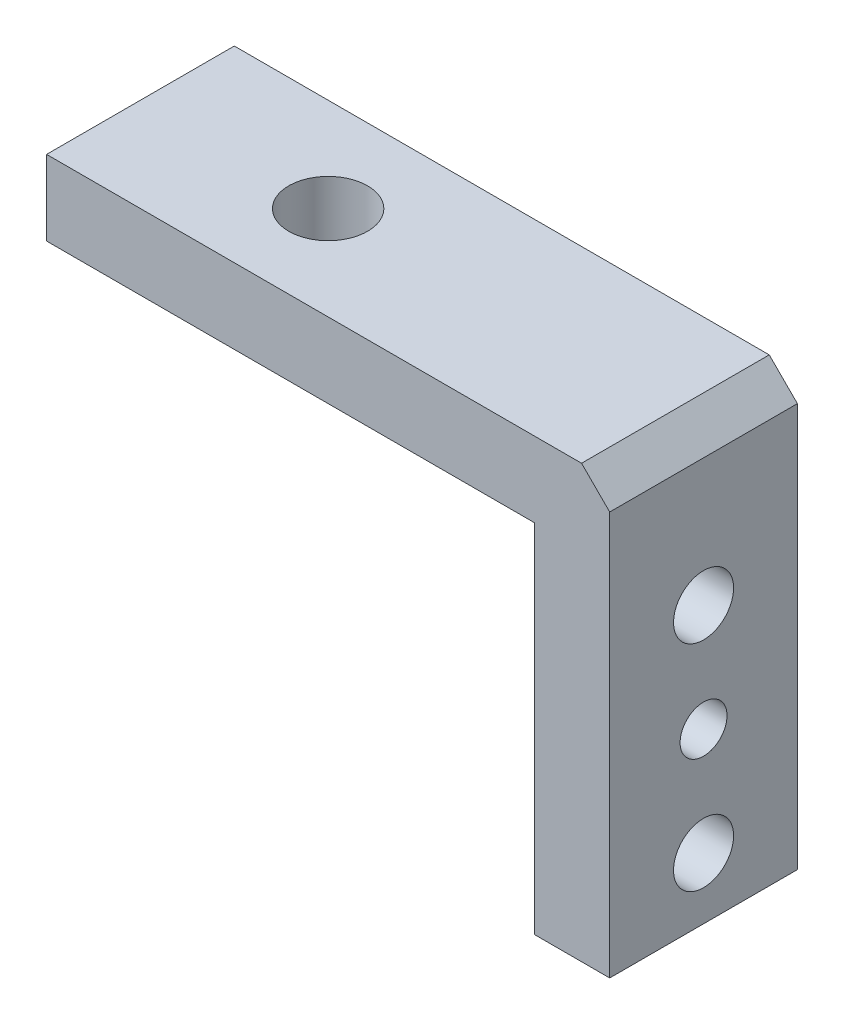
ISO-10303-21;
HEADER;
FILE_DESCRIPTION(('STEP AP214'),'2;1');
FILE_NAME('part.step','',(''),(''),'','','');
FILE_SCHEMA(('AUTOMOTIVE_DESIGN { 1 0 10303 214 1 1 1 1 }'));
ENDSEC;
DATA;
#1=APPLICATION_CONTEXT('core data for automotive mechanical design processes');
#2=APPLICATION_PROTOCOL_DEFINITION('international standard','automotive_design',2000,#1);
#3=PRODUCT_CONTEXT('',#1,'mechanical');
#4=PRODUCT('Part','Part','',(#3));
#5=PRODUCT_RELATED_PRODUCT_CATEGORY('part','',(#4));
#6=PRODUCT_DEFINITION_FORMATION('','',#4);
#7=PRODUCT_DEFINITION_CONTEXT('part definition',#1,'design');
#8=PRODUCT_DEFINITION('design','',#6,#7);
#9=PRODUCT_DEFINITION_SHAPE('','',#8);
#10=(LENGTH_UNIT() NAMED_UNIT(*) SI_UNIT(.MILLI.,.METRE.));
#11=(NAMED_UNIT(*) PLANE_ANGLE_UNIT() SI_UNIT($,.RADIAN.));
#12=(NAMED_UNIT(*) SI_UNIT($,.STERADIAN.) SOLID_ANGLE_UNIT());
#13=UNCERTAINTY_MEASURE_WITH_UNIT(LENGTH_MEASURE(1.E-05),#10,'distance_accuracy_value','');
#14=(GEOMETRIC_REPRESENTATION_CONTEXT(3) GLOBAL_UNCERTAINTY_ASSIGNED_CONTEXT((#13)) GLOBAL_UNIT_ASSIGNED_CONTEXT((#10,
#11,#12)) REPRESENTATION_CONTEXT('',''));
#15=CARTESIAN_POINT('',(0.,0.,0.));
#16=DIRECTION('',(0.,0.,1.));
#17=DIRECTION('',(1.,0.,0.));
#18=AXIS2_PLACEMENT_3D('',#15,#16,#17);
#19=CARTESIAN_POINT('',(-15.,-11.5,5.));
#20=DIRECTION('',(1.,0.,0.));
#21=DIRECTION('',(0.,0.,-1.));
#22=AXIS2_PLACEMENT_3D('',#19,#20,#21);
#23=PLANE('',#22);
#24=DIRECTION('',(0.,-1.,0.));
#25=VECTOR('',#24,1.);
#26=CARTESIAN_POINT('',(-15.,-11.5,-5.));
#27=LINE('',#26,#25);
#28=CARTESIAN_POINT('',(-15.,11.5,-5.));
#29=VERTEX_POINT('',#28);
#30=CARTESIAN_POINT('',(-15.,7.5,-5.));
#31=VERTEX_POINT('',#30);
#32=EDGE_CURVE('E117',#29,#31,#27,.T.);
#33=ORIENTED_EDGE('',*,*,#32,.T.);
#34=DIRECTION('',(0.,0.,1.));
#35=VECTOR('',#34,1.);
#36=CARTESIAN_POINT('',(-15.,7.5,-5.));
#37=LINE('',#36,#35);
#38=CARTESIAN_POINT('',(-15.,7.5,5.));
#39=VERTEX_POINT('',#38);
#40=EDGE_CURVE('E122',#31,#39,#37,.T.);
#41=ORIENTED_EDGE('',*,*,#40,.T.);
#42=DIRECTION('',(0.,-1.,0.));
#43=VECTOR('',#42,1.);
#44=CARTESIAN_POINT('',(-15.,-11.5,5.));
#45=LINE('',#44,#43);
#46=CARTESIAN_POINT('',(-15.,11.5,5.));
#47=VERTEX_POINT('',#46);
#48=EDGE_CURVE('E127',#47,#39,#45,.T.);
#49=ORIENTED_EDGE('',*,*,#48,.F.);
#50=DIRECTION('',(0.,0.,-1.));
#51=VECTOR('',#50,1.);
#52=CARTESIAN_POINT('',(-15.,11.5,5.));
#53=LINE('',#52,#51);
#54=EDGE_CURVE('E128',#47,#29,#53,.T.);
#55=ORIENTED_EDGE('',*,*,#54,.T.);
#56=EDGE_LOOP('',(#33,#41,#49,#55));
#57=FACE_BOUND('',#56,.T.);
#58=ADVANCED_FACE('F35',(#57),#23,.F.);
#59=CARTESIAN_POINT('',(15.,-11.5,5.));
#60=DIRECTION('',(0.,1.,0.));
#61=DIRECTION('',(-1.,0.,0.));
#62=AXIS2_PLACEMENT_3D('',#59,#60,#61);
#63=PLANE('',#62);
#64=DIRECTION('',(1.,0.,0.));
#65=VECTOR('',#64,1.);
#66=CARTESIAN_POINT('',(15.,-11.5,5.));
#67=LINE('',#66,#65);
#68=CARTESIAN_POINT('',(11.,-11.5,5.));
#69=VERTEX_POINT('',#68);
#70=CARTESIAN_POINT('',(15.,-11.5,5.));
#71=VERTEX_POINT('',#70);
#72=EDGE_CURVE('E113',#69,#71,#67,.T.);
#73=ORIENTED_EDGE('',*,*,#72,.F.);
#74=DIRECTION('',(0.,0.,1.));
#75=VECTOR('',#74,1.);
#76=CARTESIAN_POINT('',(11.,-11.5,-5.));
#77=LINE('',#76,#75);
#78=CARTESIAN_POINT('',(11.,-11.5,-5.));
#79=VERTEX_POINT('',#78);
#80=EDGE_CURVE('E99',#79,#69,#77,.T.);
#81=ORIENTED_EDGE('',*,*,#80,.F.);
#82=DIRECTION('',(1.,0.,0.));
#83=VECTOR('',#82,1.);
#84=CARTESIAN_POINT('',(15.,-11.5,-5.));
#85=LINE('',#84,#83);
#86=CARTESIAN_POINT('',(15.,-11.5,-5.));
#87=VERTEX_POINT('',#86);
#88=EDGE_CURVE('E111',#79,#87,#85,.T.);
#89=ORIENTED_EDGE('',*,*,#88,.T.);
#90=DIRECTION('',(0.,0.,-1.));
#91=VECTOR('',#90,1.);
#92=CARTESIAN_POINT('',(15.,-11.5,5.));
#93=LINE('',#92,#91);
#94=EDGE_CURVE('E131',#71,#87,#93,.T.);
#95=ORIENTED_EDGE('',*,*,#94,.F.);
#96=EDGE_LOOP('',(#73,#81,#89,#95));
#97=FACE_BOUND('',#96,.T.);
#98=ADVANCED_FACE('F109',(#97),#63,.F.);
#99=CARTESIAN_POINT('',(15.,-11.5,5.));
#100=DIRECTION('',(-1.,0.,0.));
#101=DIRECTION('',(0.,0.,1.));
#102=AXIS2_PLACEMENT_3D('',#99,#100,#101);
#103=PLANE('',#102);
#104=CARTESIAN_POINT('',(15.,-2.517,0.));
#105=DIRECTION('',(1.,0.,0.));
#106=DIRECTION('',(0.,0.,-1.));
#107=AXIS2_PLACEMENT_3D('',#104,#105,#106);
#108=CIRCLE('',#107,1.24999999999999);
#109=CARTESIAN_POINT('',(15.,-2.517,-1.24999999999999));
#110=VERTEX_POINT('',#109);
#111=EDGE_CURVE('E205',#110,#110,#108,.T.);
#112=ORIENTED_EDGE('',*,*,#111,.F.);
#113=EDGE_LOOP('',(#112));
#114=FACE_BOUND('',#113,.T.);
#115=CARTESIAN_POINT('',(15.,-8.232,0.));
#116=DIRECTION('',(1.,0.,0.));
#117=DIRECTION('',(0.,0.,-1.));
#118=AXIS2_PLACEMENT_3D('',#115,#116,#117);
#119=CIRCLE('',#118,1.6);
#120=CARTESIAN_POINT('',(15.,-8.232,-1.6));
#121=VERTEX_POINT('',#120);
#122=EDGE_CURVE('E209',#121,#121,#119,.T.);
#123=ORIENTED_EDGE('',*,*,#122,.F.);
#124=EDGE_LOOP('',(#123));
#125=FACE_BOUND('',#124,.T.);
#126=CARTESIAN_POINT('',(15.,3.198,0.));
#127=DIRECTION('',(1.,0.,0.));
#128=DIRECTION('',(0.,0.,-1.));
#129=AXIS2_PLACEMENT_3D('',#126,#127,#128);
#130=CIRCLE('',#129,1.6);
#131=CARTESIAN_POINT('',(15.,3.198,-1.6));
#132=VERTEX_POINT('',#131);
#133=EDGE_CURVE('E215',#132,#132,#130,.T.);
#134=ORIENTED_EDGE('',*,*,#133,.F.);
#135=EDGE_LOOP('',(#134));
#136=FACE_BOUND('',#135,.T.);
#137=DIRECTION('',(0.,1.,0.));
#138=VECTOR('',#137,1.);
#139=CARTESIAN_POINT('',(15.,-11.5,-5.));
#140=LINE('',#139,#138);
#141=CARTESIAN_POINT('',(15.,9.99999999999999,-5.));
#142=VERTEX_POINT('',#141);
#143=EDGE_CURVE('E116',#87,#142,#140,.T.);
#144=ORIENTED_EDGE('',*,*,#143,.T.);
#145=DIRECTION('',(0.,0.,1.));
#146=VECTOR('',#145,1.);
#147=CARTESIAN_POINT('',(15.,9.99999999999999,5.));
#148=LINE('',#147,#146);
#149=CARTESIAN_POINT('',(15.,9.99999999999999,5.));
#150=VERTEX_POINT('',#149);
#151=EDGE_CURVE('E44',#142,#150,#148,.T.);
#152=ORIENTED_EDGE('',*,*,#151,.T.);
#153=DIRECTION('',(0.,1.,0.));
#154=VECTOR('',#153,1.);
#155=CARTESIAN_POINT('',(15.,-11.5,5.));
#156=LINE('',#155,#154);
#157=EDGE_CURVE('E153',#71,#150,#156,.T.);
#158=ORIENTED_EDGE('',*,*,#157,.F.);
#159=ORIENTED_EDGE('',*,*,#94,.T.);
#160=EDGE_LOOP('',(#144,#152,#158,#159));
#161=FACE_BOUND('',#160,.T.);
#162=ADVANCED_FACE('F174',(#114,#125,#136,#161),#103,.F.);
#163=CARTESIAN_POINT('',(15.,11.5,5.));
#164=DIRECTION('',(0.,-1.,0.));
#165=DIRECTION('',(1.,0.,0.));
#166=AXIS2_PLACEMENT_3D('',#163,#164,#165);
#167=PLANE('',#166);
#168=CARTESIAN_POINT('',(-5.,11.5,0.));
#169=DIRECTION('',(0.,1.,0.));
#170=DIRECTION('',(0.,0.,1.));
#171=AXIS2_PLACEMENT_3D('',#168,#169,#170);
#172=CIRCLE('',#171,2.1);
#173=CARTESIAN_POINT('',(-5.,11.5,2.1));
#174=VERTEX_POINT('',#173);
#175=EDGE_CURVE('E221',#174,#174,#172,.T.);
#176=ORIENTED_EDGE('',*,*,#175,.F.);
#177=EDGE_LOOP('',(#176));
#178=FACE_BOUND('',#177,.T.);
#179=DIRECTION('',(-1.,0.,0.));
#180=VECTOR('',#179,1.);
#181=CARTESIAN_POINT('',(15.,11.5,5.));
#182=LINE('',#181,#180);
#183=CARTESIAN_POINT('',(13.5,11.5,5.));
#184=VERTEX_POINT('',#183);
#185=EDGE_CURVE('E132',#184,#47,#182,.T.);
#186=ORIENTED_EDGE('',*,*,#185,.F.);
#187=DIRECTION('',(0.,0.,-1.));
#188=VECTOR('',#187,1.);
#189=CARTESIAN_POINT('',(13.5,11.5,5.));
#190=LINE('',#189,#188);
#191=CARTESIAN_POINT('',(13.5,11.5,-5.));
#192=VERTEX_POINT('',#191);
#193=EDGE_CURVE('E134',#184,#192,#190,.T.);
#194=ORIENTED_EDGE('',*,*,#193,.T.);
#195=DIRECTION('',(-1.,0.,0.));
#196=VECTOR('',#195,1.);
#197=CARTESIAN_POINT('',(15.,11.5,-5.));
#198=LINE('',#197,#196);
#199=EDGE_CURVE('E119',#192,#29,#198,.T.);
#200=ORIENTED_EDGE('',*,*,#199,.T.);
#201=ORIENTED_EDGE('',*,*,#54,.F.);
#202=EDGE_LOOP('',(#186,#194,#200,#201));
#203=FACE_BOUND('',#202,.T.);
#204=ADVANCED_FACE('F141',(#178,#203),#167,.F.);
#205=CARTESIAN_POINT('',(0.,0.,5.));
#206=DIRECTION('',(0.,0.,1.));
#207=DIRECTION('',(1.,0.,0.));
#208=AXIS2_PLACEMENT_3D('',#205,#206,#207);
#209=PLANE('',#208);
#210=ORIENTED_EDGE('',*,*,#157,.T.);
#211=DIRECTION('',(0.707106781186546,-0.707106781186549,0.));
#212=VECTOR('',#211,1.);
#213=CARTESIAN_POINT('',(12.5,12.5,5.));
#214=LINE('',#213,#212);
#215=EDGE_CURVE('E11',#150,#184,#214,.F.);
#216=ORIENTED_EDGE('',*,*,#215,.T.);
#217=ORIENTED_EDGE('',*,*,#185,.T.);
#218=ORIENTED_EDGE('',*,*,#48,.T.);
#219=DIRECTION('',(-1.,0.,0.));
#220=VECTOR('',#219,1.);
#221=CARTESIAN_POINT('',(-15.,7.5,5.));
#222=LINE('',#221,#220);
#223=CARTESIAN_POINT('',(11.,7.5,5.));
#224=VERTEX_POINT('',#223);
#225=EDGE_CURVE('E105',#224,#39,#222,.T.);
#226=ORIENTED_EDGE('',*,*,#225,.F.);
#227=DIRECTION('',(0.,1.,0.));
#228=VECTOR('',#227,1.);
#229=CARTESIAN_POINT('',(11.,-11.5,5.));
#230=LINE('',#229,#228);
#231=EDGE_CURVE('E226',#69,#224,#230,.T.);
#232=ORIENTED_EDGE('',*,*,#231,.F.);
#233=ORIENTED_EDGE('',*,*,#72,.T.);
#234=EDGE_LOOP('',(#210,#216,#217,#218,#226,#232,#233));
#235=FACE_BOUND('',#234,.T.);
#236=ADVANCED_FACE('F157',(#235),#209,.T.);
#237=CARTESIAN_POINT('',(0.,0.,-5.));
#238=DIRECTION('',(0.,0.,1.));
#239=DIRECTION('',(1.,0.,0.));
#240=AXIS2_PLACEMENT_3D('',#237,#238,#239);
#241=PLANE('',#240);
#242=ORIENTED_EDGE('',*,*,#199,.F.);
#243=DIRECTION('',(-0.707106781186546,0.707106781186549,0.));
#244=VECTOR('',#243,1.);
#245=CARTESIAN_POINT('',(13.5,11.5,-5.));
#246=LINE('',#245,#244);
#247=EDGE_CURVE('E58',#192,#142,#246,.F.);
#248=ORIENTED_EDGE('',*,*,#247,.T.);
#249=ORIENTED_EDGE('',*,*,#143,.F.);
#250=ORIENTED_EDGE('',*,*,#88,.F.);
#251=DIRECTION('',(0.,1.,0.));
#252=VECTOR('',#251,1.);
#253=CARTESIAN_POINT('',(11.,-11.5,-5.));
#254=LINE('',#253,#252);
#255=CARTESIAN_POINT('',(11.,7.5,-5.));
#256=VERTEX_POINT('',#255);
#257=EDGE_CURVE('E95',#79,#256,#254,.T.);
#258=ORIENTED_EDGE('',*,*,#257,.T.);
#259=DIRECTION('',(-1.,0.,0.));
#260=VECTOR('',#259,1.);
#261=CARTESIAN_POINT('',(-15.,7.5,-5.));
#262=LINE('',#261,#260);
#263=EDGE_CURVE('E104',#256,#31,#262,.T.);
#264=ORIENTED_EDGE('',*,*,#263,.T.);
#265=ORIENTED_EDGE('',*,*,#32,.F.);
#266=EDGE_LOOP('',(#242,#248,#249,#250,#258,#264,#265));
#267=FACE_BOUND('',#266,.T.);
#268=ADVANCED_FACE('F115',(#267),#241,.F.);
#269=CARTESIAN_POINT('',(-15.,7.5,-5.));
#270=DIRECTION('',(0.,1.,0.));
#271=DIRECTION('',(0.,0.,1.));
#272=AXIS2_PLACEMENT_3D('',#269,#270,#271);
#273=PLANE('',#272);
#274=CARTESIAN_POINT('',(-5.,7.5,0.));
#275=DIRECTION('',(0.,1.,0.));
#276=DIRECTION('',(0.,0.,1.));
#277=AXIS2_PLACEMENT_3D('',#274,#275,#276);
#278=CIRCLE('',#277,2.1);
#279=CARTESIAN_POINT('',(-5.,7.5,2.1));
#280=VERTEX_POINT('',#279);
#281=EDGE_CURVE('E224',#280,#280,#278,.T.);
#282=ORIENTED_EDGE('',*,*,#281,.T.);
#283=EDGE_LOOP('',(#282));
#284=FACE_BOUND('',#283,.T.);
#285=ORIENTED_EDGE('',*,*,#225,.T.);
#286=ORIENTED_EDGE('',*,*,#40,.F.);
#287=ORIENTED_EDGE('',*,*,#263,.F.);
#288=DIRECTION('',(0.,0.,1.));
#289=VECTOR('',#288,1.);
#290=CARTESIAN_POINT('',(11.,7.5,-5.));
#291=LINE('',#290,#289);
#292=EDGE_CURVE('E101',#256,#224,#291,.T.);
#293=ORIENTED_EDGE('',*,*,#292,.T.);
#294=EDGE_LOOP('',(#285,#286,#287,#293));
#295=FACE_BOUND('',#294,.T.);
#296=ADVANCED_FACE('F167',(#284,#295),#273,.F.);
#297=CARTESIAN_POINT('',(11.,-11.5,-5.));
#298=DIRECTION('',(1.,0.,0.));
#299=DIRECTION('',(0.,0.,-1.));
#300=AXIS2_PLACEMENT_3D('',#297,#298,#299);
#301=PLANE('',#300);
#302=CARTESIAN_POINT('',(11.,-2.517,0.));
#303=DIRECTION('',(1.,0.,0.));
#304=DIRECTION('',(0.,0.,-1.));
#305=AXIS2_PLACEMENT_3D('',#302,#303,#304);
#306=CIRCLE('',#305,1.24999999999999);
#307=CARTESIAN_POINT('',(11.,-2.517,-1.24999999999999));
#308=VERTEX_POINT('',#307);
#309=EDGE_CURVE('E208',#308,#308,#306,.T.);
#310=ORIENTED_EDGE('',*,*,#309,.T.);
#311=EDGE_LOOP('',(#310));
#312=FACE_BOUND('',#311,.T.);
#313=CARTESIAN_POINT('',(11.,-8.232,0.));
#314=DIRECTION('',(1.,0.,0.));
#315=DIRECTION('',(0.,0.,-1.));
#316=AXIS2_PLACEMENT_3D('',#313,#314,#315);
#317=CIRCLE('',#316,1.59999999999999);
#318=CARTESIAN_POINT('',(11.,-8.232,-1.59999999999999));
#319=VERTEX_POINT('',#318);
#320=EDGE_CURVE('E39',#319,#319,#317,.T.);
#321=ORIENTED_EDGE('',*,*,#320,.T.);
#322=EDGE_LOOP('',(#321));
#323=FACE_BOUND('',#322,.T.);
#324=CARTESIAN_POINT('',(11.,3.198,0.));
#325=DIRECTION('',(1.,0.,0.));
#326=DIRECTION('',(0.,0.,-1.));
#327=AXIS2_PLACEMENT_3D('',#324,#325,#326);
#328=CIRCLE('',#327,1.59999999999999);
#329=CARTESIAN_POINT('',(11.,3.198,-1.59999999999999));
#330=VERTEX_POINT('',#329);
#331=EDGE_CURVE('E218',#330,#330,#328,.T.);
#332=ORIENTED_EDGE('',*,*,#331,.T.);
#333=EDGE_LOOP('',(#332));
#334=FACE_BOUND('',#333,.T.);
#335=ORIENTED_EDGE('',*,*,#231,.T.);
#336=ORIENTED_EDGE('',*,*,#292,.F.);
#337=ORIENTED_EDGE('',*,*,#257,.F.);
#338=ORIENTED_EDGE('',*,*,#80,.T.);
#339=EDGE_LOOP('',(#335,#336,#337,#338));
#340=FACE_BOUND('',#339,.T.);
#341=ADVANCED_FACE('F98',(#312,#323,#334,#340),#301,.F.);
#342=CARTESIAN_POINT('',(13.5,11.5,5.));
#343=DIRECTION('',(-0.707106781186549,-0.707106781186546,0.));
#344=DIRECTION('',(0.,0.,-1.));
#345=AXIS2_PLACEMENT_3D('',#342,#343,#344);
#346=PLANE('',#345);
#347=ORIENTED_EDGE('',*,*,#215,.F.);
#348=ORIENTED_EDGE('',*,*,#151,.F.);
#349=ORIENTED_EDGE('',*,*,#247,.F.);
#350=ORIENTED_EDGE('',*,*,#193,.F.);
#351=EDGE_LOOP('',(#347,#348,#349,#350));
#352=FACE_BOUND('',#351,.T.);
#353=ADVANCED_FACE('F37',(#352),#346,.F.);
#354=CARTESIAN_POINT('',(-5.,11.5,0.));
#355=DIRECTION('',(0.,1.,0.));
#356=DIRECTION('',(0.,0.,1.));
#357=AXIS2_PLACEMENT_3D('',#354,#355,#356);
#358=CYLINDRICAL_SURFACE('',#357,2.1);
#359=ORIENTED_EDGE('',*,*,#175,.T.);
#360=EDGE_LOOP('',(#359));
#361=FACE_BOUND('',#360,.T.);
#362=ORIENTED_EDGE('',*,*,#281,.F.);
#363=EDGE_LOOP('',(#362));
#364=FACE_BOUND('',#363,.T.);
#365=ADVANCED_FACE('F159',(#361,#364),#358,.F.);
#366=CARTESIAN_POINT('',(15.,3.198,0.));
#367=DIRECTION('',(1.,0.,0.));
#368=DIRECTION('',(0.,0.,-1.));
#369=AXIS2_PLACEMENT_3D('',#366,#367,#368);
#370=CYLINDRICAL_SURFACE('',#369,1.59999999999999);
#371=ORIENTED_EDGE('',*,*,#133,.T.);
#372=EDGE_LOOP('',(#371));
#373=FACE_BOUND('',#372,.T.);
#374=ORIENTED_EDGE('',*,*,#331,.F.);
#375=EDGE_LOOP('',(#374));
#376=FACE_BOUND('',#375,.T.);
#377=ADVANCED_FACE('F164',(#373,#376),#370,.F.);
#378=CARTESIAN_POINT('',(15.,-8.232,0.));
#379=DIRECTION('',(1.,0.,0.));
#380=DIRECTION('',(0.,0.,-1.));
#381=AXIS2_PLACEMENT_3D('',#378,#379,#380);
#382=CYLINDRICAL_SURFACE('',#381,1.59999999999999);
#383=ORIENTED_EDGE('',*,*,#122,.T.);
#384=EDGE_LOOP('',(#383));
#385=FACE_BOUND('',#384,.T.);
#386=ORIENTED_EDGE('',*,*,#320,.F.);
#387=EDGE_LOOP('',(#386));
#388=FACE_BOUND('',#387,.T.);
#389=ADVANCED_FACE('F192',(#385,#388),#382,.F.);
#390=CARTESIAN_POINT('',(15.,-2.517,0.));
#391=DIRECTION('',(1.,0.,0.));
#392=DIRECTION('',(0.,0.,-1.));
#393=AXIS2_PLACEMENT_3D('',#390,#391,#392);
#394=CYLINDRICAL_SURFACE('',#393,1.24999999999999);
#395=ORIENTED_EDGE('',*,*,#111,.T.);
#396=EDGE_LOOP('',(#395));
#397=FACE_BOUND('',#396,.T.);
#398=ORIENTED_EDGE('',*,*,#309,.F.);
#399=EDGE_LOOP('',(#398));
#400=FACE_BOUND('',#399,.T.);
#401=ADVANCED_FACE('F196',(#397,#400),#394,.F.);
#402=CLOSED_SHELL('',(#58,#98,#162,#204,#236,#268,#296,#341,#353,#365,#377,#389,#401));
#403=MANIFOLD_SOLID_BREP('B2',#402);
#404=ADVANCED_BREP_SHAPE_REPRESENTATION('',(#18,#403),#14);
#405=SHAPE_DEFINITION_REPRESENTATION(#9,#404);
ENDSEC;
END-ISO-10303-21;
